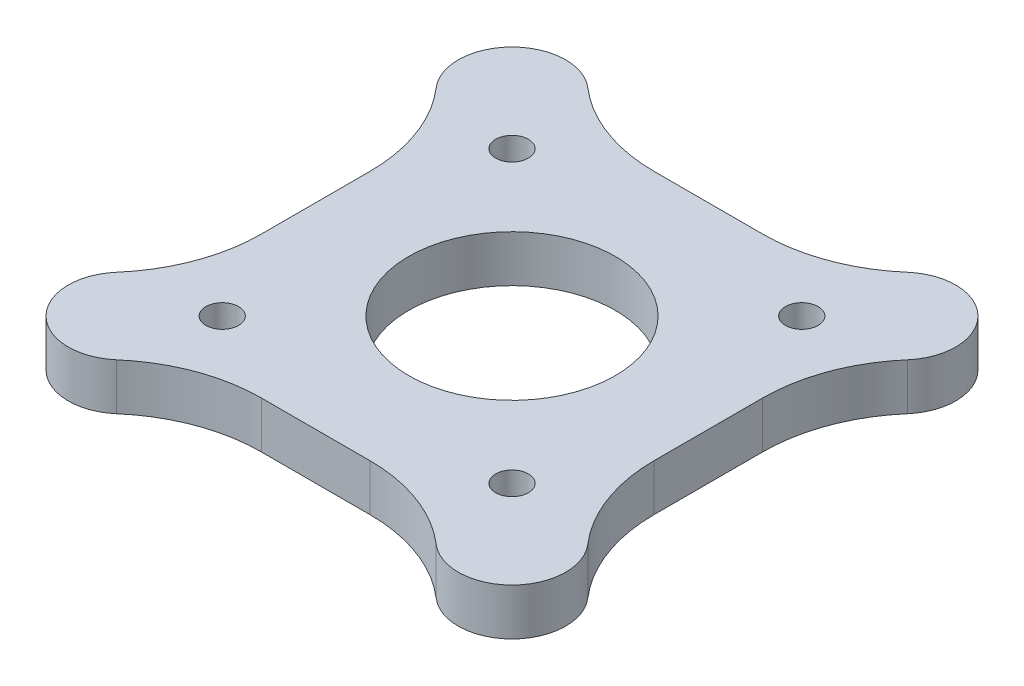
ISO-10303-21;
HEADER;
FILE_DESCRIPTION(('STEP AP214'),'2;1');
FILE_NAME('part.step','',(''),(''),'','','');
FILE_SCHEMA(('AUTOMOTIVE_DESIGN { 1 0 10303 214 1 1 1 1 }'));
ENDSEC;
DATA;
#1=APPLICATION_CONTEXT('core data for automotive mechanical design processes');
#2=APPLICATION_PROTOCOL_DEFINITION('international standard','automotive_design',2000,#1);
#3=PRODUCT_CONTEXT('',#1,'mechanical');
#4=PRODUCT('Part','Part','',(#3));
#5=PRODUCT_RELATED_PRODUCT_CATEGORY('part','',(#4));
#6=PRODUCT_DEFINITION_FORMATION('','',#4);
#7=PRODUCT_DEFINITION_CONTEXT('part definition',#1,'design');
#8=PRODUCT_DEFINITION('design','',#6,#7);
#9=PRODUCT_DEFINITION_SHAPE('','',#8);
#10=(LENGTH_UNIT() NAMED_UNIT(*) SI_UNIT(.MILLI.,.METRE.));
#11=(NAMED_UNIT(*) PLANE_ANGLE_UNIT() SI_UNIT($,.RADIAN.));
#12=(NAMED_UNIT(*) SI_UNIT($,.STERADIAN.) SOLID_ANGLE_UNIT());
#13=UNCERTAINTY_MEASURE_WITH_UNIT(LENGTH_MEASURE(1.E-05),#10,'distance_accuracy_value','');
#14=(GEOMETRIC_REPRESENTATION_CONTEXT(3) GLOBAL_UNCERTAINTY_ASSIGNED_CONTEXT((#13)) GLOBAL_UNIT_ASSIGNED_CONTEXT((#10,
#11,#12)) REPRESENTATION_CONTEXT('',''));
#15=CARTESIAN_POINT('',(0.,0.,0.));
#16=DIRECTION('',(0.,0.,1.));
#17=DIRECTION('',(1.,0.,0.));
#18=AXIS2_PLACEMENT_3D('',#15,#16,#17);
#19=CARTESIAN_POINT('',(21.,5.,21.));
#20=DIRECTION('',(-1.,0.,0.));
#21=DIRECTION('',(0.,0.,1.));
#22=AXIS2_PLACEMENT_3D('',#19,#20,#21);
#23=PLANE('',#22);
#24=DIRECTION('',(0.,-1.,0.));
#25=VECTOR('',#24,1.);
#26=CARTESIAN_POINT('',(21.0000000000001,5.,-5.80218169007108));
#27=LINE('',#26,#25);
#28=CARTESIAN_POINT('',(21.,5.,-5.80218169007108));
#29=VERTEX_POINT('',#28);
#30=CARTESIAN_POINT('',(21.,0.,-5.80218169007108));
#31=VERTEX_POINT('',#30);
#32=EDGE_CURVE('E350',#29,#31,#27,.T.);
#33=ORIENTED_EDGE('',*,*,#32,.F.);
#34=DIRECTION('',(0.,0.,-1.));
#35=VECTOR('',#34,1.);
#36=CARTESIAN_POINT('',(21.,5.,21.));
#37=LINE('',#36,#35);
#38=CARTESIAN_POINT('',(21.,5.,5.80218169007131));
#39=VERTEX_POINT('',#38);
#40=EDGE_CURVE('E163',#39,#29,#37,.T.);
#41=ORIENTED_EDGE('',*,*,#40,.F.);
#42=DIRECTION('',(0.,-1.,0.));
#43=VECTOR('',#42,1.);
#44=CARTESIAN_POINT('',(21.,5.,5.80218169007131));
#45=LINE('',#44,#43);
#46=CARTESIAN_POINT('',(21.,0.,5.80218169007131));
#47=VERTEX_POINT('',#46);
#48=EDGE_CURVE('E247',#39,#47,#45,.T.);
#49=ORIENTED_EDGE('',*,*,#48,.T.);
#50=DIRECTION('',(0.,0.,-1.));
#51=VECTOR('',#50,1.);
#52=CARTESIAN_POINT('',(21.,0.,21.));
#53=LINE('',#52,#51);
#54=EDGE_CURVE('E283',#47,#31,#53,.T.);
#55=ORIENTED_EDGE('',*,*,#54,.T.);
#56=EDGE_LOOP('',(#33,#41,#49,#55));
#57=FACE_BOUND('',#56,.T.);
#58=ADVANCED_FACE('F33',(#57),#23,.F.);
#59=CARTESIAN_POINT('',(-21.,5.,-21.));
#60=DIRECTION('',(0.,0.,1.));
#61=DIRECTION('',(1.,0.,0.));
#62=AXIS2_PLACEMENT_3D('',#59,#60,#61);
#63=PLANE('',#62);
#64=DIRECTION('',(-1.,0.,0.));
#65=VECTOR('',#64,1.);
#66=CARTESIAN_POINT('',(-21.,5.,-21.));
#67=LINE('',#66,#65);
#68=CARTESIAN_POINT('',(5.80218169007152,5.,-21.));
#69=VERTEX_POINT('',#68);
#70=CARTESIAN_POINT('',(-5.80218169007116,5.,-21.));
#71=VERTEX_POINT('',#70);
#72=EDGE_CURVE('E49',#69,#71,#67,.T.);
#73=ORIENTED_EDGE('',*,*,#72,.F.);
#74=DIRECTION('',(0.,-1.,0.));
#75=VECTOR('',#74,1.);
#76=CARTESIAN_POINT('',(5.80218169007153,5.,-20.9999999999999));
#77=LINE('',#76,#75);
#78=CARTESIAN_POINT('',(5.80218169007152,0.,-21.));
#79=VERTEX_POINT('',#78);
#80=EDGE_CURVE('E54',#69,#79,#77,.T.);
#81=ORIENTED_EDGE('',*,*,#80,.T.);
#82=DIRECTION('',(-1.,0.,0.));
#83=VECTOR('',#82,1.);
#84=CARTESIAN_POINT('',(-21.,0.,-21.));
#85=LINE('',#84,#83);
#86=CARTESIAN_POINT('',(-5.80218169007116,0.,-21.));
#87=VERTEX_POINT('',#86);
#88=EDGE_CURVE('E290',#79,#87,#85,.T.);
#89=ORIENTED_EDGE('',*,*,#88,.T.);
#90=DIRECTION('',(0.,-1.,0.));
#91=VECTOR('',#90,1.);
#92=CARTESIAN_POINT('',(-5.80218169007116,5.,-21.));
#93=LINE('',#92,#91);
#94=EDGE_CURVE('E187',#71,#87,#93,.T.);
#95=ORIENTED_EDGE('',*,*,#94,.F.);
#96=EDGE_LOOP('',(#73,#81,#89,#95));
#97=FACE_BOUND('',#96,.T.);
#98=ADVANCED_FACE('F340',(#97),#63,.F.);
#99=CARTESIAN_POINT('',(-21.,5.,21.));
#100=DIRECTION('',(1.,0.,0.));
#101=DIRECTION('',(0.,0.,-1.));
#102=AXIS2_PLACEMENT_3D('',#99,#100,#101);
#103=PLANE('',#102);
#104=DIRECTION('',(0.,0.,1.));
#105=VECTOR('',#104,1.);
#106=CARTESIAN_POINT('',(-21.,5.,21.));
#107=LINE('',#106,#105);
#108=CARTESIAN_POINT('',(-21.,5.,-5.80218169007145));
#109=VERTEX_POINT('',#108);
#110=CARTESIAN_POINT('',(-21.,5.,5.80218169007123));
#111=VERTEX_POINT('',#110);
#112=EDGE_CURVE('E41',#109,#111,#107,.T.);
#113=ORIENTED_EDGE('',*,*,#112,.F.);
#114=DIRECTION('',(0.,-1.,0.));
#115=VECTOR('',#114,1.);
#116=CARTESIAN_POINT('',(-21.,5.,-5.80218169007146));
#117=LINE('',#116,#115);
#118=CARTESIAN_POINT('',(-21.,0.,-5.80218169007145));
#119=VERTEX_POINT('',#118);
#120=EDGE_CURVE('E194',#109,#119,#117,.T.);
#121=ORIENTED_EDGE('',*,*,#120,.T.);
#122=DIRECTION('',(0.,0.,1.));
#123=VECTOR('',#122,1.);
#124=CARTESIAN_POINT('',(-21.,0.,21.));
#125=LINE('',#124,#123);
#126=CARTESIAN_POINT('',(-21.,0.,5.80218169007123));
#127=VERTEX_POINT('',#126);
#128=EDGE_CURVE('E291',#119,#127,#125,.T.);
#129=ORIENTED_EDGE('',*,*,#128,.T.);
#130=DIRECTION('',(0.,-1.,0.));
#131=VECTOR('',#130,1.);
#132=CARTESIAN_POINT('',(-21.,5.,5.80218169007123));
#133=LINE('',#132,#131);
#134=EDGE_CURVE('E212',#111,#127,#133,.T.);
#135=ORIENTED_EDGE('',*,*,#134,.F.);
#136=EDGE_LOOP('',(#113,#121,#129,#135));
#137=FACE_BOUND('',#136,.T.);
#138=ADVANCED_FACE('F326',(#137),#103,.F.);
#139=CARTESIAN_POINT('',(-21.,5.,21.));
#140=DIRECTION('',(0.,0.,-1.));
#141=DIRECTION('',(-1.,0.,0.));
#142=AXIS2_PLACEMENT_3D('',#139,#140,#141);
#143=PLANE('',#142);
#144=DIRECTION('',(1.,0.,0.));
#145=VECTOR('',#144,1.);
#146=CARTESIAN_POINT('',(-21.,5.,21.));
#147=LINE('',#146,#145);
#148=CARTESIAN_POINT('',(-5.80218169007139,5.,21.));
#149=VERTEX_POINT('',#148);
#150=CARTESIAN_POINT('',(5.8021816900713,5.,21.));
#151=VERTEX_POINT('',#150);
#152=EDGE_CURVE('E11',#149,#151,#147,.T.);
#153=ORIENTED_EDGE('',*,*,#152,.F.);
#154=DIRECTION('',(0.,-1.,0.));
#155=VECTOR('',#154,1.);
#156=CARTESIAN_POINT('',(-5.80218169007138,5.,21.));
#157=LINE('',#156,#155);
#158=CARTESIAN_POINT('',(-5.80218169007139,0.,21.));
#159=VERTEX_POINT('',#158);
#160=EDGE_CURVE('E221',#149,#159,#157,.T.);
#161=ORIENTED_EDGE('',*,*,#160,.T.);
#162=DIRECTION('',(1.,0.,0.));
#163=VECTOR('',#162,1.);
#164=CARTESIAN_POINT('',(-21.,0.,21.));
#165=LINE('',#164,#163);
#166=CARTESIAN_POINT('',(5.8021816900713,0.,21.));
#167=VERTEX_POINT('',#166);
#168=EDGE_CURVE('E36',#159,#167,#165,.T.);
#169=ORIENTED_EDGE('',*,*,#168,.T.);
#170=DIRECTION('',(0.,-1.,0.));
#171=VECTOR('',#170,1.);
#172=CARTESIAN_POINT('',(5.8021816900713,5.,21.));
#173=LINE('',#172,#171);
#174=EDGE_CURVE('E238',#151,#167,#173,.T.);
#175=ORIENTED_EDGE('',*,*,#174,.F.);
#176=EDGE_LOOP('',(#153,#161,#169,#175));
#177=FACE_BOUND('',#176,.T.);
#178=ADVANCED_FACE('F298',(#177),#143,.F.);
#179=CARTESIAN_POINT('',(0.,5.,0.));
#180=DIRECTION('',(0.,-1.,0.));
#181=DIRECTION('',(0.,0.,-1.));
#182=AXIS2_PLACEMENT_3D('',#179,#180,#181);
#183=PLANE('',#182);
#184=CARTESIAN_POINT('',(5.80218169007171,5.,-38.2635146413605));
#185=DIRECTION('',(0.,-1.,0.));
#186=DIRECTION('',(0.,0.,1.));
#187=AXIS2_PLACEMENT_3D('',#184,#185,#186);
#188=CIRCLE('',#187,17.2635146413606);
#189=CARTESIAN_POINT('',(17.0974935734642,5.,-25.2080610977503));
#190=VERTEX_POINT('',#189);
#191=EDGE_CURVE('E155',#190,#69,#188,.T.);
#192=ORIENTED_EDGE('',*,*,#191,.T.);
#193=ORIENTED_EDGE('',*,*,#72,.T.);
#194=CARTESIAN_POINT('',(-5.80218169007104,5.,-38.2635146413606));
#195=DIRECTION('',(0.,-1.,0.));
#196=DIRECTION('',(0.,0.,-1.));
#197=AXIS2_PLACEMENT_3D('',#194,#195,#196);
#198=CIRCLE('',#197,17.2635146413606);
#199=CARTESIAN_POINT('',(-17.0974935734637,5.,-25.2080610977506));
#200=VERTEX_POINT('',#199);
#201=EDGE_CURVE('E179',#71,#200,#198,.T.);
#202=ORIENTED_EDGE('',*,*,#201,.T.);
#203=CARTESIAN_POINT('',(-20.859650045003,5.,-20.8596500450033));
#204=DIRECTION('',(0.,1.,0.));
#205=DIRECTION('',(0.,0.,-1.));
#206=AXIS2_PLACEMENT_3D('',#203,#204,#205);
#207=CIRCLE('',#206,5.75);
#208=CARTESIAN_POINT('',(-25.2080610977504,5.,-17.0974935734641));
#209=VERTEX_POINT('',#208);
#210=EDGE_CURVE('E182',#200,#209,#207,.T.);
#211=ORIENTED_EDGE('',*,*,#210,.T.);
#212=CARTESIAN_POINT('',(-38.2635146413605,5.,-5.80218169007158));
#213=DIRECTION('',(0.,-1.,0.));
#214=DIRECTION('',(0.,0.,1.));
#215=AXIS2_PLACEMENT_3D('',#212,#213,#214);
#216=CIRCLE('',#215,17.2635146413606);
#217=EDGE_CURVE('E185',#209,#109,#216,.T.);
#218=ORIENTED_EDGE('',*,*,#217,.T.);
#219=ORIENTED_EDGE('',*,*,#112,.T.);
#220=CARTESIAN_POINT('',(-38.2635146413606,5.,5.80218169007117));
#221=DIRECTION('',(0.,-1.,0.));
#222=DIRECTION('',(0.,0.,-1.));
#223=AXIS2_PLACEMENT_3D('',#220,#221,#222);
#224=CIRCLE('',#223,17.2635146413606);
#225=CARTESIAN_POINT('',(-25.2080610977506,5.,17.0974935734638));
#226=VERTEX_POINT('',#225);
#227=EDGE_CURVE('E203',#111,#226,#224,.T.);
#228=ORIENTED_EDGE('',*,*,#227,.T.);
#229=CARTESIAN_POINT('',(-20.8596500450032,5.,20.8596500450031));
#230=DIRECTION('',(0.,1.,0.));
#231=DIRECTION('',(0.,0.,-1.));
#232=AXIS2_PLACEMENT_3D('',#229,#230,#231);
#233=CIRCLE('',#232,5.75);
#234=CARTESIAN_POINT('',(-17.097493573464,5.,25.2080610977504));
#235=VERTEX_POINT('',#234);
#236=EDGE_CURVE('E206',#226,#235,#233,.T.);
#237=ORIENTED_EDGE('',*,*,#236,.T.);
#238=CARTESIAN_POINT('',(-5.80218169007144,5.,38.2635146413605));
#239=DIRECTION('',(0.,-1.,0.));
#240=DIRECTION('',(0.,0.,1.));
#241=AXIS2_PLACEMENT_3D('',#238,#239,#240);
#242=CIRCLE('',#241,17.2635146413606);
#243=EDGE_CURVE('E209',#235,#149,#242,.T.);
#244=ORIENTED_EDGE('',*,*,#243,.T.);
#245=ORIENTED_EDGE('',*,*,#152,.T.);
#246=CARTESIAN_POINT('',(5.8021816900713,5.,38.2635146413606));
#247=DIRECTION('',(0.,-1.,0.));
#248=DIRECTION('',(0.,0.,-1.));
#249=AXIS2_PLACEMENT_3D('',#246,#247,#248);
#250=CIRCLE('',#249,17.2635146413606);
#251=CARTESIAN_POINT('',(17.0974935734639,5.,25.2080610977505));
#252=VERTEX_POINT('',#251);
#253=EDGE_CURVE('E230',#151,#252,#250,.T.);
#254=ORIENTED_EDGE('',*,*,#253,.T.);
#255=CARTESIAN_POINT('',(20.8596500450031,5.,20.8596500450031));
#256=DIRECTION('',(0.,1.,0.));
#257=DIRECTION('',(0.,0.,-1.));
#258=AXIS2_PLACEMENT_3D('',#255,#256,#257);
#259=CIRCLE('',#258,5.75);
#260=CARTESIAN_POINT('',(25.2080610977505,5.,17.0974935734639));
#261=VERTEX_POINT('',#260);
#262=EDGE_CURVE('E233',#252,#261,#259,.T.);
#263=ORIENTED_EDGE('',*,*,#262,.T.);
#264=CARTESIAN_POINT('',(38.2635146413606,5.,5.80218169007131));
#265=DIRECTION('',(0.,-1.,0.));
#266=DIRECTION('',(0.,0.,1.));
#267=AXIS2_PLACEMENT_3D('',#264,#265,#266);
#268=CIRCLE('',#267,17.2635146413606);
#269=EDGE_CURVE('E236',#261,#39,#268,.T.);
#270=ORIENTED_EDGE('',*,*,#269,.T.);
#271=ORIENTED_EDGE('',*,*,#40,.T.);
#272=CARTESIAN_POINT('',(38.2635146413606,5.,-5.8021816900709));
#273=DIRECTION('',(0.,-1.,0.));
#274=DIRECTION('',(0.,0.,-1.));
#275=AXIS2_PLACEMENT_3D('',#272,#273,#274);
#276=CIRCLE('',#275,17.2635146413606);
#277=CARTESIAN_POINT('',(25.2080610977507,5.,-17.0974935734636));
#278=VERTEX_POINT('',#277);
#279=EDGE_CURVE('E156',#29,#278,#276,.T.);
#280=ORIENTED_EDGE('',*,*,#279,.T.);
#281=CARTESIAN_POINT('',(20.8596500450034,5.,-20.8596500450029));
#282=DIRECTION('',(0.,1.,0.));
#283=DIRECTION('',(0.,0.,-1.));
#284=AXIS2_PLACEMENT_3D('',#281,#282,#283);
#285=CIRCLE('',#284,5.75);
#286=EDGE_CURVE('E145',#278,#190,#285,.T.);
#287=ORIENTED_EDGE('',*,*,#286,.T.);
#288=EDGE_LOOP('',(#192,#193,#202,#211,#218,#219,#228,#237,#244,#245,#254,#263,#270,#271,#280,#287));
#289=FACE_BOUND('',#288,.T.);
#290=CARTESIAN_POINT('',(0.,5.,0.));
#291=DIRECTION('',(0.,1.,0.));
#292=DIRECTION('',(0.,0.,1.));
#293=AXIS2_PLACEMENT_3D('',#290,#291,#292);
#294=CIRCLE('',#293,11.05);
#295=CARTESIAN_POINT('',(0.,5.,11.05));
#296=VERTEX_POINT('',#295);
#297=EDGE_CURVE('E280',#296,#296,#294,.T.);
#298=ORIENTED_EDGE('',*,*,#297,.F.);
#299=EDGE_LOOP('',(#298));
#300=FACE_BOUND('',#299,.T.);
#301=CARTESIAN_POINT('',(15.5,5.,-15.5));
#302=DIRECTION('',(0.,1.,0.));
#303=DIRECTION('',(0.,0.,1.));
#304=AXIS2_PLACEMENT_3D('',#301,#302,#303);
#305=CIRCLE('',#304,1.75);
#306=CARTESIAN_POINT('',(15.5,5.,-13.75));
#307=VERTEX_POINT('',#306);
#308=EDGE_CURVE('E274',#307,#307,#305,.T.);
#309=ORIENTED_EDGE('',*,*,#308,.F.);
#310=EDGE_LOOP('',(#309));
#311=FACE_BOUND('',#310,.T.);
#312=CARTESIAN_POINT('',(15.5000000000009,5.,15.5));
#313=DIRECTION('',(0.,1.,0.));
#314=DIRECTION('',(0.,0.,1.));
#315=AXIS2_PLACEMENT_3D('',#312,#313,#314);
#316=CIRCLE('',#315,1.75);
#317=CARTESIAN_POINT('',(15.5000000000009,5.,17.25));
#318=VERTEX_POINT('',#317);
#319=EDGE_CURVE('E268',#318,#318,#316,.T.);
#320=ORIENTED_EDGE('',*,*,#319,.F.);
#321=EDGE_LOOP('',(#320));
#322=FACE_BOUND('',#321,.T.);
#323=CARTESIAN_POINT('',(-15.4999999999991,5.,15.5000000000009));
#324=DIRECTION('',(0.,1.,0.));
#325=DIRECTION('',(0.,0.,1.));
#326=AXIS2_PLACEMENT_3D('',#323,#324,#325);
#327=CIRCLE('',#326,1.75);
#328=CARTESIAN_POINT('',(-15.4999999999991,5.,17.2500000000009));
#329=VERTEX_POINT('',#328);
#330=EDGE_CURVE('E262',#329,#329,#327,.T.);
#331=ORIENTED_EDGE('',*,*,#330,.F.);
#332=EDGE_LOOP('',(#331));
#333=FACE_BOUND('',#332,.T.);
#334=CARTESIAN_POINT('',(-15.5,5.,-15.4999999999991));
#335=DIRECTION('',(0.,1.,0.));
#336=DIRECTION('',(0.,0.,1.));
#337=AXIS2_PLACEMENT_3D('',#334,#335,#336);
#338=CIRCLE('',#337,1.75);
#339=CARTESIAN_POINT('',(-15.5,5.,-13.7499999999991));
#340=VERTEX_POINT('',#339);
#341=EDGE_CURVE('E256',#340,#340,#338,.T.);
#342=ORIENTED_EDGE('',*,*,#341,.F.);
#343=EDGE_LOOP('',(#342));
#344=FACE_BOUND('',#343,.T.);
#345=ADVANCED_FACE('F160',(#289,#300,#311,#322,#333,#344),#183,.F.);
#346=CARTESIAN_POINT('',(0.,0.,0.));
#347=DIRECTION('',(0.,-1.,0.));
#348=DIRECTION('',(0.,0.,-1.));
#349=AXIS2_PLACEMENT_3D('',#346,#347,#348);
#350=PLANE('',#349);
#351=ORIENTED_EDGE('',*,*,#88,.F.);
#352=CARTESIAN_POINT('',(5.80218169007171,0.,-38.2635146413605));
#353=DIRECTION('',(0.,-1.,0.));
#354=DIRECTION('',(0.,0.,1.));
#355=AXIS2_PLACEMENT_3D('',#352,#353,#354);
#356=CIRCLE('',#355,17.2635146413606);
#357=CARTESIAN_POINT('',(17.0974935734642,0.,-25.2080610977503));
#358=VERTEX_POINT('',#357);
#359=EDGE_CURVE('E166',#358,#79,#356,.T.);
#360=ORIENTED_EDGE('',*,*,#359,.F.);
#361=CARTESIAN_POINT('',(20.8596500450034,0.,-20.8596500450029));
#362=DIRECTION('',(0.,1.,0.));
#363=DIRECTION('',(0.,0.,-1.));
#364=AXIS2_PLACEMENT_3D('',#361,#362,#363);
#365=CIRCLE('',#364,5.75);
#366=CARTESIAN_POINT('',(25.2080610977507,0.,-17.0974935734636));
#367=VERTEX_POINT('',#366);
#368=EDGE_CURVE('E345',#367,#358,#365,.T.);
#369=ORIENTED_EDGE('',*,*,#368,.F.);
#370=CARTESIAN_POINT('',(38.2635146413606,0.,-5.8021816900709));
#371=DIRECTION('',(0.,-1.,0.));
#372=DIRECTION('',(0.,0.,-1.));
#373=AXIS2_PLACEMENT_3D('',#370,#371,#372);
#374=CIRCLE('',#373,17.2635146413606);
#375=EDGE_CURVE('E170',#31,#367,#374,.T.);
#376=ORIENTED_EDGE('',*,*,#375,.F.);
#377=ORIENTED_EDGE('',*,*,#54,.F.);
#378=CARTESIAN_POINT('',(38.2635146413606,0.,5.80218169007131));
#379=DIRECTION('',(0.,-1.,0.));
#380=DIRECTION('',(0.,0.,1.));
#381=AXIS2_PLACEMENT_3D('',#378,#379,#380);
#382=CIRCLE('',#381,17.2635146413606);
#383=CARTESIAN_POINT('',(25.2080610977505,0.,17.0974935734639));
#384=VERTEX_POINT('',#383);
#385=EDGE_CURVE('E234',#384,#47,#382,.T.);
#386=ORIENTED_EDGE('',*,*,#385,.F.);
#387=CARTESIAN_POINT('',(20.8596500450031,0.,20.8596500450031));
#388=DIRECTION('',(0.,1.,0.));
#389=DIRECTION('',(0.,0.,-1.));
#390=AXIS2_PLACEMENT_3D('',#387,#388,#389);
#391=CIRCLE('',#390,5.75);
#392=CARTESIAN_POINT('',(17.0974935734639,0.,25.2080610977505));
#393=VERTEX_POINT('',#392);
#394=EDGE_CURVE('E241',#393,#384,#391,.T.);
#395=ORIENTED_EDGE('',*,*,#394,.F.);
#396=CARTESIAN_POINT('',(5.8021816900713,0.,38.2635146413606));
#397=DIRECTION('',(0.,-1.,0.));
#398=DIRECTION('',(0.,0.,-1.));
#399=AXIS2_PLACEMENT_3D('',#396,#397,#398);
#400=CIRCLE('',#399,17.2635146413606);
#401=EDGE_CURVE('E229',#167,#393,#400,.T.);
#402=ORIENTED_EDGE('',*,*,#401,.F.);
#403=ORIENTED_EDGE('',*,*,#168,.F.);
#404=CARTESIAN_POINT('',(-5.80218169007144,0.,38.2635146413605));
#405=DIRECTION('',(0.,-1.,0.));
#406=DIRECTION('',(0.,0.,1.));
#407=AXIS2_PLACEMENT_3D('',#404,#405,#406);
#408=CIRCLE('',#407,17.2635146413606);
#409=CARTESIAN_POINT('',(-17.097493573464,0.,25.2080610977504));
#410=VERTEX_POINT('',#409);
#411=EDGE_CURVE('E207',#410,#159,#408,.T.);
#412=ORIENTED_EDGE('',*,*,#411,.F.);
#413=CARTESIAN_POINT('',(-20.8596500450032,0.,20.8596500450031));
#414=DIRECTION('',(0.,1.,0.));
#415=DIRECTION('',(0.,0.,-1.));
#416=AXIS2_PLACEMENT_3D('',#413,#414,#415);
#417=CIRCLE('',#416,5.75);
#418=CARTESIAN_POINT('',(-25.2080610977506,0.,17.0974935734638));
#419=VERTEX_POINT('',#418);
#420=EDGE_CURVE('E215',#419,#410,#417,.T.);
#421=ORIENTED_EDGE('',*,*,#420,.F.);
#422=CARTESIAN_POINT('',(-38.2635146413606,0.,5.80218169007117));
#423=DIRECTION('',(0.,-1.,0.));
#424=DIRECTION('',(0.,0.,-1.));
#425=AXIS2_PLACEMENT_3D('',#422,#423,#424);
#426=CIRCLE('',#425,17.2635146413606);
#427=EDGE_CURVE('E202',#127,#419,#426,.T.);
#428=ORIENTED_EDGE('',*,*,#427,.F.);
#429=ORIENTED_EDGE('',*,*,#128,.F.);
#430=CARTESIAN_POINT('',(-38.2635146413605,0.,-5.80218169007158));
#431=DIRECTION('',(0.,-1.,0.));
#432=DIRECTION('',(0.,0.,1.));
#433=AXIS2_PLACEMENT_3D('',#430,#431,#432);
#434=CIRCLE('',#433,17.2635146413606);
#435=CARTESIAN_POINT('',(-25.2080610977504,0.,-17.0974935734641));
#436=VERTEX_POINT('',#435);
#437=EDGE_CURVE('E183',#436,#119,#434,.T.);
#438=ORIENTED_EDGE('',*,*,#437,.F.);
#439=CARTESIAN_POINT('',(-20.859650045003,0.,-20.8596500450033));
#440=DIRECTION('',(0.,1.,0.));
#441=DIRECTION('',(0.,0.,-1.));
#442=AXIS2_PLACEMENT_3D('',#439,#440,#441);
#443=CIRCLE('',#442,5.75);
#444=CARTESIAN_POINT('',(-17.0974935734637,0.,-25.2080610977506));
#445=VERTEX_POINT('',#444);
#446=EDGE_CURVE('E174',#445,#436,#443,.T.);
#447=ORIENTED_EDGE('',*,*,#446,.F.);
#448=CARTESIAN_POINT('',(-5.80218169007104,0.,-38.2635146413606));
#449=DIRECTION('',(0.,-1.,0.));
#450=DIRECTION('',(0.,0.,-1.));
#451=AXIS2_PLACEMENT_3D('',#448,#449,#450);
#452=CIRCLE('',#451,17.2635146413606);
#453=EDGE_CURVE('E171',#87,#445,#452,.T.);
#454=ORIENTED_EDGE('',*,*,#453,.F.);
#455=EDGE_LOOP('',(#351,#360,#369,#376,#377,#386,#395,#402,#403,#412,#421,#428,#429,#438,#447,#454));
#456=FACE_BOUND('',#455,.T.);
#457=CARTESIAN_POINT('',(-15.4999999999991,0.,15.5000000000009));
#458=DIRECTION('',(0.,1.,0.));
#459=DIRECTION('',(0.,0.,1.));
#460=AXIS2_PLACEMENT_3D('',#457,#458,#459);
#461=CIRCLE('',#460,1.75);
#462=CARTESIAN_POINT('',(-15.4999999999991,0.,17.2500000000009));
#463=VERTEX_POINT('',#462);
#464=EDGE_CURVE('E259',#463,#463,#461,.T.);
#465=ORIENTED_EDGE('',*,*,#464,.T.);
#466=EDGE_LOOP('',(#465));
#467=FACE_BOUND('',#466,.T.);
#468=CARTESIAN_POINT('',(15.5,0.,-15.5));
#469=DIRECTION('',(0.,1.,0.));
#470=DIRECTION('',(0.,0.,1.));
#471=AXIS2_PLACEMENT_3D('',#468,#469,#470);
#472=CIRCLE('',#471,1.75);
#473=CARTESIAN_POINT('',(15.5,0.,-13.75));
#474=VERTEX_POINT('',#473);
#475=EDGE_CURVE('E271',#474,#474,#472,.T.);
#476=ORIENTED_EDGE('',*,*,#475,.T.);
#477=EDGE_LOOP('',(#476));
#478=FACE_BOUND('',#477,.T.);
#479=CARTESIAN_POINT('',(0.,0.,0.));
#480=DIRECTION('',(0.,1.,0.));
#481=DIRECTION('',(0.,0.,1.));
#482=AXIS2_PLACEMENT_3D('',#479,#480,#481);
#483=CIRCLE('',#482,11.05);
#484=CARTESIAN_POINT('',(0.,0.,11.05));
#485=VERTEX_POINT('',#484);
#486=EDGE_CURVE('E277',#485,#485,#483,.T.);
#487=ORIENTED_EDGE('',*,*,#486,.T.);
#488=EDGE_LOOP('',(#487));
#489=FACE_BOUND('',#488,.T.);
#490=CARTESIAN_POINT('',(15.5000000000009,0.,15.5));
#491=DIRECTION('',(0.,1.,0.));
#492=DIRECTION('',(0.,0.,1.));
#493=AXIS2_PLACEMENT_3D('',#490,#491,#492);
#494=CIRCLE('',#493,1.75);
#495=CARTESIAN_POINT('',(15.5000000000009,0.,17.25));
#496=VERTEX_POINT('',#495);
#497=EDGE_CURVE('E265',#496,#496,#494,.T.);
#498=ORIENTED_EDGE('',*,*,#497,.T.);
#499=EDGE_LOOP('',(#498));
#500=FACE_BOUND('',#499,.T.);
#501=CARTESIAN_POINT('',(-15.5,0.,-15.4999999999991));
#502=DIRECTION('',(0.,1.,0.));
#503=DIRECTION('',(0.,0.,1.));
#504=AXIS2_PLACEMENT_3D('',#501,#502,#503);
#505=CIRCLE('',#504,1.75);
#506=CARTESIAN_POINT('',(-15.5,0.,-13.7499999999991));
#507=VERTEX_POINT('',#506);
#508=EDGE_CURVE('E255',#507,#507,#505,.T.);
#509=ORIENTED_EDGE('',*,*,#508,.T.);
#510=EDGE_LOOP('',(#509));
#511=FACE_BOUND('',#510,.T.);
#512=ADVANCED_FACE('F307',(#456,#467,#478,#489,#500,#511),#350,.T.);
#513=CARTESIAN_POINT('',(0.,5.,0.));
#514=DIRECTION('',(0.,-1.,0.));
#515=DIRECTION('',(0.,0.,-1.));
#516=AXIS2_PLACEMENT_3D('',#513,#514,#515);
#517=CYLINDRICAL_SURFACE('',#516,11.05);
#518=ORIENTED_EDGE('',*,*,#297,.T.);
#519=EDGE_LOOP('',(#518));
#520=FACE_BOUND('',#519,.T.);
#521=ORIENTED_EDGE('',*,*,#486,.F.);
#522=EDGE_LOOP('',(#521));
#523=FACE_BOUND('',#522,.T.);
#524=ADVANCED_FACE('F370',(#520,#523),#517,.F.);
#525=CARTESIAN_POINT('',(15.5,5.,-15.5));
#526=DIRECTION('',(0.,-1.,0.));
#527=DIRECTION('',(0.,0.,-1.));
#528=AXIS2_PLACEMENT_3D('',#525,#526,#527);
#529=CYLINDRICAL_SURFACE('',#528,1.75);
#530=ORIENTED_EDGE('',*,*,#308,.T.);
#531=EDGE_LOOP('',(#530));
#532=FACE_BOUND('',#531,.T.);
#533=ORIENTED_EDGE('',*,*,#475,.F.);
#534=EDGE_LOOP('',(#533));
#535=FACE_BOUND('',#534,.T.);
#536=ADVANCED_FACE('F375',(#532,#535),#529,.F.);
#537=CARTESIAN_POINT('',(15.5000000000009,5.,15.5));
#538=DIRECTION('',(0.,-1.,0.));
#539=DIRECTION('',(0.,0.,-1.));
#540=AXIS2_PLACEMENT_3D('',#537,#538,#539);
#541=CYLINDRICAL_SURFACE('',#540,1.75);
#542=ORIENTED_EDGE('',*,*,#319,.T.);
#543=EDGE_LOOP('',(#542));
#544=FACE_BOUND('',#543,.T.);
#545=ORIENTED_EDGE('',*,*,#497,.F.);
#546=EDGE_LOOP('',(#545));
#547=FACE_BOUND('',#546,.T.);
#548=ADVANCED_FACE('F379',(#544,#547),#541,.F.);
#549=CARTESIAN_POINT('',(-15.4999999999991,5.,15.5000000000009));
#550=DIRECTION('',(0.,-1.,0.));
#551=DIRECTION('',(0.,0.,-1.));
#552=AXIS2_PLACEMENT_3D('',#549,#550,#551);
#553=CYLINDRICAL_SURFACE('',#552,1.75);
#554=ORIENTED_EDGE('',*,*,#330,.T.);
#555=EDGE_LOOP('',(#554));
#556=FACE_BOUND('',#555,.T.);
#557=ORIENTED_EDGE('',*,*,#464,.F.);
#558=EDGE_LOOP('',(#557));
#559=FACE_BOUND('',#558,.T.);
#560=ADVANCED_FACE('F383',(#556,#559),#553,.F.);
#561=CARTESIAN_POINT('',(-15.5,5.,-15.4999999999991));
#562=DIRECTION('',(0.,-1.,0.));
#563=DIRECTION('',(0.,0.,-1.));
#564=AXIS2_PLACEMENT_3D('',#561,#562,#563);
#565=CYLINDRICAL_SURFACE('',#564,1.75);
#566=ORIENTED_EDGE('',*,*,#341,.T.);
#567=EDGE_LOOP('',(#566));
#568=FACE_BOUND('',#567,.T.);
#569=ORIENTED_EDGE('',*,*,#508,.F.);
#570=EDGE_LOOP('',(#569));
#571=FACE_BOUND('',#570,.T.);
#572=ADVANCED_FACE('F387',(#568,#571),#565,.F.);
#573=CARTESIAN_POINT('',(5.8021816900713,5.,38.2635146413606));
#574=DIRECTION('',(0.,-1.,0.));
#575=DIRECTION('',(0.,0.,-1.));
#576=AXIS2_PLACEMENT_3D('',#573,#574,#575);
#577=CYLINDRICAL_SURFACE('',#576,17.2635146413606);
#578=ORIENTED_EDGE('',*,*,#401,.T.);
#579=DIRECTION('',(0.,-1.,0.));
#580=VECTOR('',#579,1.);
#581=CARTESIAN_POINT('',(17.0974935734639,5.,25.2080610977505));
#582=LINE('',#581,#580);
#583=EDGE_CURVE('E252',#252,#393,#582,.T.);
#584=ORIENTED_EDGE('',*,*,#583,.F.);
#585=ORIENTED_EDGE('',*,*,#253,.F.);
#586=ORIENTED_EDGE('',*,*,#174,.T.);
#587=EDGE_LOOP('',(#578,#584,#585,#586));
#588=FACE_BOUND('',#587,.T.);
#589=ADVANCED_FACE('F305',(#588),#577,.F.);
#590=CARTESIAN_POINT('',(20.8596500450031,5.,20.8596500450031));
#591=DIRECTION('',(0.,-1.,0.));
#592=DIRECTION('',(0.,0.,-1.));
#593=AXIS2_PLACEMENT_3D('',#590,#591,#592);
#594=CYLINDRICAL_SURFACE('',#593,5.75);
#595=ORIENTED_EDGE('',*,*,#394,.T.);
#596=DIRECTION('',(0.,-1.,0.));
#597=VECTOR('',#596,1.);
#598=CARTESIAN_POINT('',(25.2080610977505,5.,17.0974935734639));
#599=LINE('',#598,#597);
#600=EDGE_CURVE('E249',#261,#384,#599,.T.);
#601=ORIENTED_EDGE('',*,*,#600,.F.);
#602=ORIENTED_EDGE('',*,*,#262,.F.);
#603=ORIENTED_EDGE('',*,*,#583,.T.);
#604=EDGE_LOOP('',(#595,#601,#602,#603));
#605=FACE_BOUND('',#604,.T.);
#606=ADVANCED_FACE('F313',(#605),#594,.T.);
#607=CARTESIAN_POINT('',(38.2635146413606,5.,5.80218169007131));
#608=DIRECTION('',(0.,-1.,0.));
#609=DIRECTION('',(0.,0.,-1.));
#610=AXIS2_PLACEMENT_3D('',#607,#608,#609);
#611=CYLINDRICAL_SURFACE('',#610,17.2635146413606);
#612=ORIENTED_EDGE('',*,*,#385,.T.);
#613=ORIENTED_EDGE('',*,*,#48,.F.);
#614=ORIENTED_EDGE('',*,*,#269,.F.);
#615=ORIENTED_EDGE('',*,*,#600,.T.);
#616=EDGE_LOOP('',(#612,#613,#614,#615));
#617=FACE_BOUND('',#616,.T.);
#618=ADVANCED_FACE('F355',(#617),#611,.F.);
#619=CARTESIAN_POINT('',(-38.2635146413606,5.,5.80218169007117));
#620=DIRECTION('',(0.,-1.,0.));
#621=DIRECTION('',(0.,0.,-1.));
#622=AXIS2_PLACEMENT_3D('',#619,#620,#621);
#623=CYLINDRICAL_SURFACE('',#622,17.2635146413606);
#624=ORIENTED_EDGE('',*,*,#427,.T.);
#625=DIRECTION('',(0.,-1.,0.));
#626=VECTOR('',#625,1.);
#627=CARTESIAN_POINT('',(-25.2080610977506,5.,17.0974935734638));
#628=LINE('',#627,#626);
#629=EDGE_CURVE('E226',#226,#419,#628,.T.);
#630=ORIENTED_EDGE('',*,*,#629,.F.);
#631=ORIENTED_EDGE('',*,*,#227,.F.);
#632=ORIENTED_EDGE('',*,*,#134,.T.);
#633=EDGE_LOOP('',(#624,#630,#631,#632));
#634=FACE_BOUND('',#633,.T.);
#635=ADVANCED_FACE('F325',(#634),#623,.F.);
#636=CARTESIAN_POINT('',(-20.8596500450032,5.,20.8596500450031));
#637=DIRECTION('',(0.,-1.,0.));
#638=DIRECTION('',(0.,0.,-1.));
#639=AXIS2_PLACEMENT_3D('',#636,#637,#638);
#640=CYLINDRICAL_SURFACE('',#639,5.75);
#641=ORIENTED_EDGE('',*,*,#420,.T.);
#642=DIRECTION('',(0.,-1.,0.));
#643=VECTOR('',#642,1.);
#644=CARTESIAN_POINT('',(-17.097493573464,5.,25.2080610977504));
#645=LINE('',#644,#643);
#646=EDGE_CURVE('E223',#235,#410,#645,.T.);
#647=ORIENTED_EDGE('',*,*,#646,.F.);
#648=ORIENTED_EDGE('',*,*,#236,.F.);
#649=ORIENTED_EDGE('',*,*,#629,.T.);
#650=EDGE_LOOP('',(#641,#647,#648,#649));
#651=FACE_BOUND('',#650,.T.);
#652=ADVANCED_FACE('F322',(#651),#640,.T.);
#653=CARTESIAN_POINT('',(-5.80218169007144,5.,38.2635146413605));
#654=DIRECTION('',(0.,-1.,0.));
#655=DIRECTION('',(0.,0.,-1.));
#656=AXIS2_PLACEMENT_3D('',#653,#654,#655);
#657=CYLINDRICAL_SURFACE('',#656,17.2635146413606);
#658=ORIENTED_EDGE('',*,*,#411,.T.);
#659=ORIENTED_EDGE('',*,*,#160,.F.);
#660=ORIENTED_EDGE('',*,*,#243,.F.);
#661=ORIENTED_EDGE('',*,*,#646,.T.);
#662=EDGE_LOOP('',(#658,#659,#660,#661));
#663=FACE_BOUND('',#662,.T.);
#664=ADVANCED_FACE('F318',(#663),#657,.F.);
#665=CARTESIAN_POINT('',(-5.80218169007104,5.,-38.2635146413606));
#666=DIRECTION('',(0.,-1.,0.));
#667=DIRECTION('',(0.,0.,-1.));
#668=AXIS2_PLACEMENT_3D('',#665,#666,#667);
#669=CYLINDRICAL_SURFACE('',#668,17.2635146413606);
#670=ORIENTED_EDGE('',*,*,#453,.T.);
#671=DIRECTION('',(0.,-1.,0.));
#672=VECTOR('',#671,1.);
#673=CARTESIAN_POINT('',(-17.0974935734637,5.,-25.2080610977506));
#674=LINE('',#673,#672);
#675=EDGE_CURVE('E199',#200,#445,#674,.T.);
#676=ORIENTED_EDGE('',*,*,#675,.F.);
#677=ORIENTED_EDGE('',*,*,#201,.F.);
#678=ORIENTED_EDGE('',*,*,#94,.T.);
#679=EDGE_LOOP('',(#670,#676,#677,#678));
#680=FACE_BOUND('',#679,.T.);
#681=ADVANCED_FACE('F339',(#680),#669,.F.);
#682=CARTESIAN_POINT('',(-20.859650045003,5.,-20.8596500450033));
#683=DIRECTION('',(0.,-1.,0.));
#684=DIRECTION('',(0.,0.,-1.));
#685=AXIS2_PLACEMENT_3D('',#682,#683,#684);
#686=CYLINDRICAL_SURFACE('',#685,5.75);
#687=ORIENTED_EDGE('',*,*,#446,.T.);
#688=DIRECTION('',(0.,-1.,0.));
#689=VECTOR('',#688,1.);
#690=CARTESIAN_POINT('',(-25.2080610977504,5.,-17.0974935734641));
#691=LINE('',#690,#689);
#692=EDGE_CURVE('E196',#209,#436,#691,.T.);
#693=ORIENTED_EDGE('',*,*,#692,.F.);
#694=ORIENTED_EDGE('',*,*,#210,.F.);
#695=ORIENTED_EDGE('',*,*,#675,.T.);
#696=EDGE_LOOP('',(#687,#693,#694,#695));
#697=FACE_BOUND('',#696,.T.);
#698=ADVANCED_FACE('F336',(#697),#686,.T.);
#699=CARTESIAN_POINT('',(-38.2635146413605,5.,-5.80218169007158));
#700=DIRECTION('',(0.,-1.,0.));
#701=DIRECTION('',(0.,0.,-1.));
#702=AXIS2_PLACEMENT_3D('',#699,#700,#701);
#703=CYLINDRICAL_SURFACE('',#702,17.2635146413606);
#704=ORIENTED_EDGE('',*,*,#437,.T.);
#705=ORIENTED_EDGE('',*,*,#120,.F.);
#706=ORIENTED_EDGE('',*,*,#217,.F.);
#707=ORIENTED_EDGE('',*,*,#692,.T.);
#708=EDGE_LOOP('',(#704,#705,#706,#707));
#709=FACE_BOUND('',#708,.T.);
#710=ADVANCED_FACE('F331',(#709),#703,.F.);
#711=CARTESIAN_POINT('',(38.2635146413606,5.,-5.8021816900709));
#712=DIRECTION('',(0.,-1.,0.));
#713=DIRECTION('',(0.,0.,-1.));
#714=AXIS2_PLACEMENT_3D('',#711,#712,#713);
#715=CYLINDRICAL_SURFACE('',#714,17.2635146413606);
#716=ORIENTED_EDGE('',*,*,#375,.T.);
#717=DIRECTION('',(0.,-1.,0.));
#718=VECTOR('',#717,1.);
#719=CARTESIAN_POINT('',(25.2080610977507,5.,-17.0974935734636));
#720=LINE('',#719,#718);
#721=EDGE_CURVE('E149',#278,#367,#720,.T.);
#722=ORIENTED_EDGE('',*,*,#721,.F.);
#723=ORIENTED_EDGE('',*,*,#279,.F.);
#724=ORIENTED_EDGE('',*,*,#32,.T.);
#725=EDGE_LOOP('',(#716,#722,#723,#724));
#726=FACE_BOUND('',#725,.T.);
#727=ADVANCED_FACE('F168',(#726),#715,.F.);
#728=CARTESIAN_POINT('',(20.8596500450034,5.,-20.8596500450029));
#729=DIRECTION('',(0.,-1.,0.));
#730=DIRECTION('',(0.,0.,-1.));
#731=AXIS2_PLACEMENT_3D('',#728,#729,#730);
#732=CYLINDRICAL_SURFACE('',#731,5.75);
#733=ORIENTED_EDGE('',*,*,#368,.T.);
#734=DIRECTION('',(0.,-1.,0.));
#735=VECTOR('',#734,1.);
#736=CARTESIAN_POINT('',(17.0974935734642,5.,-25.2080610977503));
#737=LINE('',#736,#735);
#738=EDGE_CURVE('E152',#190,#358,#737,.T.);
#739=ORIENTED_EDGE('',*,*,#738,.F.);
#740=ORIENTED_EDGE('',*,*,#286,.F.);
#741=ORIENTED_EDGE('',*,*,#721,.T.);
#742=EDGE_LOOP('',(#733,#739,#740,#741));
#743=FACE_BOUND('',#742,.T.);
#744=ADVANCED_FACE('F147',(#743),#732,.T.);
#745=CARTESIAN_POINT('',(5.80218169007171,5.,-38.2635146413605));
#746=DIRECTION('',(0.,-1.,0.));
#747=DIRECTION('',(0.,0.,-1.));
#748=AXIS2_PLACEMENT_3D('',#745,#746,#747);
#749=CYLINDRICAL_SURFACE('',#748,17.2635146413606);
#750=ORIENTED_EDGE('',*,*,#359,.T.);
#751=ORIENTED_EDGE('',*,*,#80,.F.);
#752=ORIENTED_EDGE('',*,*,#191,.F.);
#753=ORIENTED_EDGE('',*,*,#738,.T.);
#754=EDGE_LOOP('',(#750,#751,#752,#753));
#755=FACE_BOUND('',#754,.T.);
#756=ADVANCED_FACE('F344',(#755),#749,.F.);
#757=CLOSED_SHELL('',(#58,#98,#138,#178,#345,#512,#524,#536,#548,#560,#572,#589,#606,#618,#635,
#652,#664,#681,#698,#710,#727,#744,#756));
#758=MANIFOLD_SOLID_BREP('B2',#757);
#759=ADVANCED_BREP_SHAPE_REPRESENTATION('',(#18,#758),#14);
#760=SHAPE_DEFINITION_REPRESENTATION(#9,#759);
ENDSEC;
END-ISO-10303-21;
